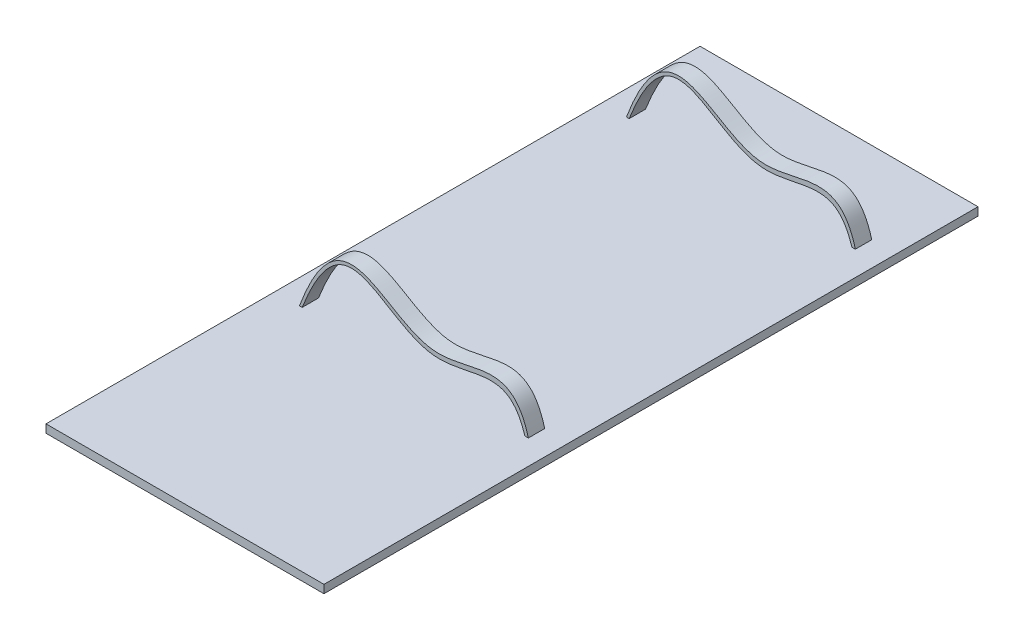
ISO-10303-21;
HEADER;
FILE_DESCRIPTION(('STEP AP214'),'2;1');
FILE_NAME('part.step','',(''),(''),'','','');
FILE_SCHEMA(('AUTOMOTIVE_DESIGN { 1 0 10303 214 1 1 1 1 }'));
ENDSEC;
DATA;
#1=APPLICATION_CONTEXT('core data for automotive mechanical design processes');
#2=APPLICATION_PROTOCOL_DEFINITION('international standard','automotive_design',2000,#1);
#3=PRODUCT_CONTEXT('',#1,'mechanical');
#4=PRODUCT('Part','Part','',(#3));
#5=PRODUCT_RELATED_PRODUCT_CATEGORY('part','',(#4));
#6=PRODUCT_DEFINITION_FORMATION('','',#4);
#7=PRODUCT_DEFINITION_CONTEXT('part definition',#1,'design');
#8=PRODUCT_DEFINITION('design','',#6,#7);
#9=PRODUCT_DEFINITION_SHAPE('','',#8);
#10=(LENGTH_UNIT() NAMED_UNIT(*) SI_UNIT(.MILLI.,.METRE.));
#11=(NAMED_UNIT(*) PLANE_ANGLE_UNIT() SI_UNIT($,.RADIAN.));
#12=(NAMED_UNIT(*) SI_UNIT($,.STERADIAN.) SOLID_ANGLE_UNIT());
#13=UNCERTAINTY_MEASURE_WITH_UNIT(LENGTH_MEASURE(1.E-05),#10,'distance_accuracy_value','');
#14=(GEOMETRIC_REPRESENTATION_CONTEXT(3) GLOBAL_UNCERTAINTY_ASSIGNED_CONTEXT((#13)) GLOBAL_UNIT_ASSIGNED_CONTEXT((#10,
#11,#12)) REPRESENTATION_CONTEXT('',''));
#15=CARTESIAN_POINT('',(0.,0.,0.));
#16=DIRECTION('',(0.,0.,1.));
#17=DIRECTION('',(1.,0.,0.));
#18=AXIS2_PLACEMENT_3D('',#15,#16,#17);
#19=CARTESIAN_POINT('',(0.,2.5,0.));
#20=DIRECTION('',(0.,-1.,0.));
#21=DIRECTION('',(0.,0.,-1.));
#22=AXIS2_PLACEMENT_3D('',#19,#20,#21);
#23=PLANE('',#22);
#24=DIRECTION('',(-1.,0.,0.));
#25=VECTOR('',#24,1.);
#26=CARTESIAN_POINT('',(77.5,2.5,-70.));
#27=LINE('',#26,#25);
#28=CARTESIAN_POINT('',(77.5,2.5,-70.));
#29=VERTEX_POINT('',#28);
#30=CARTESIAN_POINT('',(76.450132058504,2.5,-70.));
#31=VERTEX_POINT('',#30);
#32=EDGE_CURVE('E122',#29,#31,#27,.T.);
#33=ORIENTED_EDGE('',*,*,#32,.T.);
#34=DIRECTION('',(0.,0.,-1.));
#35=VECTOR('',#34,1.);
#36=CARTESIAN_POINT('',(76.450132058504,2.5,-70.));
#37=LINE('',#36,#35);
#38=CARTESIAN_POINT('',(76.450132058504,2.5,-75.));
#39=VERTEX_POINT('',#38);
#40=EDGE_CURVE('E143',#31,#39,#37,.T.);
#41=ORIENTED_EDGE('',*,*,#40,.T.);
#42=DIRECTION('',(-1.,0.,0.));
#43=VECTOR('',#42,1.);
#44=CARTESIAN_POINT('',(77.5,2.5,-75.));
#45=LINE('',#44,#43);
#46=CARTESIAN_POINT('',(77.5,2.5,-75.));
#47=VERTEX_POINT('',#46);
#48=EDGE_CURVE('E142',#47,#39,#45,.T.);
#49=ORIENTED_EDGE('',*,*,#48,.F.);
#50=DIRECTION('',(0.,0.,-1.));
#51=VECTOR('',#50,1.);
#52=CARTESIAN_POINT('',(77.5,2.5,-70.));
#53=LINE('',#52,#51);
#54=EDGE_CURVE('E135',#29,#47,#53,.T.);
#55=ORIENTED_EDGE('',*,*,#54,.F.);
#56=EDGE_LOOP('',(#33,#41,#49,#55));
#57=FACE_BOUND('',#56,.T.);
#58=DIRECTION('',(-1.,0.,0.));
#59=VECTOR('',#58,1.);
#60=CARTESIAN_POINT('',(77.5,2.5,-170.));
#61=LINE('',#60,#59);
#62=CARTESIAN_POINT('',(77.5,2.5,-170.));
#63=VERTEX_POINT('',#62);
#64=CARTESIAN_POINT('',(76.450132058504,2.5,-170.));
#65=VERTEX_POINT('',#64);
#66=EDGE_CURVE('E157',#63,#65,#61,.T.);
#67=ORIENTED_EDGE('',*,*,#66,.T.);
#68=DIRECTION('',(0.,0.,-1.));
#69=VECTOR('',#68,1.);
#70=CARTESIAN_POINT('',(76.450132058504,2.5,-170.));
#71=LINE('',#70,#69);
#72=CARTESIAN_POINT('',(76.450132058504,2.5,-175.));
#73=VERTEX_POINT('',#72);
#74=EDGE_CURVE('E234',#65,#73,#71,.T.);
#75=ORIENTED_EDGE('',*,*,#74,.T.);
#76=DIRECTION('',(-1.,0.,0.));
#77=VECTOR('',#76,1.);
#78=CARTESIAN_POINT('',(77.5,2.5,-175.));
#79=LINE('',#78,#77);
#80=CARTESIAN_POINT('',(77.5,2.5,-175.));
#81=VERTEX_POINT('',#80);
#82=EDGE_CURVE('E300',#81,#73,#79,.T.);
#83=ORIENTED_EDGE('',*,*,#82,.F.);
#84=DIRECTION('',(0.,0.,-1.));
#85=VECTOR('',#84,1.);
#86=CARTESIAN_POINT('',(77.5,2.5,-170.));
#87=LINE('',#86,#85);
#88=EDGE_CURVE('E241',#63,#81,#87,.T.);
#89=ORIENTED_EDGE('',*,*,#88,.F.);
#90=EDGE_LOOP('',(#67,#75,#83,#89));
#91=FACE_BOUND('',#90,.T.);
#92=DIRECTION('',(0.,0.,1.));
#93=VECTOR('',#92,1.);
#94=CARTESIAN_POINT('',(0.,2.5,0.));
#95=LINE('',#94,#93);
#96=CARTESIAN_POINT('',(0.,2.5,-200.));
#97=VERTEX_POINT('',#96);
#98=CARTESIAN_POINT('',(0.,2.5,0.));
#99=VERTEX_POINT('',#98);
#100=EDGE_CURVE('E209',#97,#99,#95,.T.);
#101=ORIENTED_EDGE('',*,*,#100,.T.);
#102=DIRECTION('',(1.,0.,0.));
#103=VECTOR('',#102,1.);
#104=CARTESIAN_POINT('',(0.,2.5,0.));
#105=LINE('',#104,#103);
#106=CARTESIAN_POINT('',(85.,2.5,0.));
#107=VERTEX_POINT('',#106);
#108=EDGE_CURVE('E223',#99,#107,#105,.T.);
#109=ORIENTED_EDGE('',*,*,#108,.T.);
#110=DIRECTION('',(0.,0.,-1.));
#111=VECTOR('',#110,1.);
#112=CARTESIAN_POINT('',(85.,2.5,0.));
#113=LINE('',#112,#111);
#114=CARTESIAN_POINT('',(85.,2.5,-200.));
#115=VERTEX_POINT('',#114);
#116=EDGE_CURVE('E204',#107,#115,#113,.T.);
#117=ORIENTED_EDGE('',*,*,#116,.T.);
#118=DIRECTION('',(-1.,0.,0.));
#119=VECTOR('',#118,1.);
#120=CARTESIAN_POINT('',(0.,2.5,-200.));
#121=LINE('',#120,#119);
#122=EDGE_CURVE('E216',#115,#97,#121,.T.);
#123=ORIENTED_EDGE('',*,*,#122,.T.);
#124=EDGE_LOOP('',(#101,#109,#117,#123));
#125=FACE_BOUND('',#124,.T.);
#126=DIRECTION('',(-1.,0.,0.));
#127=VECTOR('',#126,1.);
#128=CARTESIAN_POINT('',(8.33670505188138,2.5,-170.));
#129=LINE('',#128,#127);
#130=CARTESIAN_POINT('',(8.33670505188136,2.5,-170.));
#131=VERTEX_POINT('',#130);
#132=CARTESIAN_POINT('',(7.50000000000001,2.50000000000001,-170.));
#133=VERTEX_POINT('',#132);
#134=EDGE_CURVE('E244',#131,#133,#129,.T.);
#135=ORIENTED_EDGE('',*,*,#134,.T.);
#136=DIRECTION('',(0.,0.,-1.));
#137=VECTOR('',#136,1.);
#138=CARTESIAN_POINT('',(7.50000000000001,2.50000000000001,-170.));
#139=LINE('',#138,#137);
#140=CARTESIAN_POINT('',(7.50000000000001,2.50000000000001,-175.));
#141=VERTEX_POINT('',#140);
#142=EDGE_CURVE('E226',#133,#141,#139,.T.);
#143=ORIENTED_EDGE('',*,*,#142,.T.);
#144=DIRECTION('',(-1.,0.,0.));
#145=VECTOR('',#144,1.);
#146=CARTESIAN_POINT('',(8.33670505188138,2.5,-175.));
#147=LINE('',#146,#145);
#148=CARTESIAN_POINT('',(8.33670505188136,2.5,-175.));
#149=VERTEX_POINT('',#148);
#150=EDGE_CURVE('E158',#149,#141,#147,.T.);
#151=ORIENTED_EDGE('',*,*,#150,.F.);
#152=DIRECTION('',(0.,0.,-1.));
#153=VECTOR('',#152,1.);
#154=CARTESIAN_POINT('',(8.33670505188136,2.5,-170.));
#155=LINE('',#154,#153);
#156=EDGE_CURVE('E228',#131,#149,#155,.T.);
#157=ORIENTED_EDGE('',*,*,#156,.F.);
#158=EDGE_LOOP('',(#135,#143,#151,#157));
#159=FACE_BOUND('',#158,.T.);
#160=DIRECTION('',(-1.,0.,0.));
#161=VECTOR('',#160,1.);
#162=CARTESIAN_POINT('',(8.33670505188138,2.5,-70.));
#163=LINE('',#162,#161);
#164=CARTESIAN_POINT('',(8.33670505188136,2.5,-70.));
#165=VERTEX_POINT('',#164);
#166=CARTESIAN_POINT('',(7.50000000000001,2.50000000000001,-70.));
#167=VERTEX_POINT('',#166);
#168=EDGE_CURVE('E144',#165,#167,#163,.T.);
#169=ORIENTED_EDGE('',*,*,#168,.T.);
#170=DIRECTION('',(0.,0.,-1.));
#171=VECTOR('',#170,1.);
#172=CARTESIAN_POINT('',(7.50000000000001,2.50000000000001,-70.));
#173=LINE('',#172,#171);
#174=CARTESIAN_POINT('',(7.50000000000001,2.50000000000001,-75.));
#175=VERTEX_POINT('',#174);
#176=EDGE_CURVE('E138',#167,#175,#173,.T.);
#177=ORIENTED_EDGE('',*,*,#176,.T.);
#178=DIRECTION('',(-1.,0.,0.));
#179=VECTOR('',#178,1.);
#180=CARTESIAN_POINT('',(8.33670505188138,2.5,-75.));
#181=LINE('',#180,#179);
#182=CARTESIAN_POINT('',(8.33670505188136,2.5,-75.));
#183=VERTEX_POINT('',#182);
#184=EDGE_CURVE('E139',#183,#175,#181,.T.);
#185=ORIENTED_EDGE('',*,*,#184,.F.);
#186=DIRECTION('',(0.,0.,-1.));
#187=VECTOR('',#186,1.);
#188=CARTESIAN_POINT('',(8.33670505188136,2.5,-70.));
#189=LINE('',#188,#187);
#190=EDGE_CURVE('E146',#165,#183,#189,.T.);
#191=ORIENTED_EDGE('',*,*,#190,.F.);
#192=EDGE_LOOP('',(#169,#177,#185,#191));
#193=FACE_BOUND('',#192,.T.);
#194=ADVANCED_FACE('F33',(#57,#91,#125,#159,#193),#23,.F.);
#195=CARTESIAN_POINT('',(0.,2.5,0.));
#196=DIRECTION('',(1.,0.,0.));
#197=DIRECTION('',(0.,0.,-1.));
#198=AXIS2_PLACEMENT_3D('',#195,#196,#197);
#199=PLANE('',#198);
#200=DIRECTION('',(0.,0.,1.));
#201=VECTOR('',#200,1.);
#202=CARTESIAN_POINT('',(0.,0.,0.));
#203=LINE('',#202,#201);
#204=CARTESIAN_POINT('',(0.,0.,-200.));
#205=VERTEX_POINT('',#204);
#206=CARTESIAN_POINT('',(0.,0.,0.));
#207=VERTEX_POINT('',#206);
#208=EDGE_CURVE('E200',#205,#207,#203,.T.);
#209=ORIENTED_EDGE('',*,*,#208,.T.);
#210=DIRECTION('',(0.,-1.,0.));
#211=VECTOR('',#210,1.);
#212=CARTESIAN_POINT('',(0.,2.5,0.));
#213=LINE('',#212,#211);
#214=EDGE_CURVE('E11',#99,#207,#213,.T.);
#215=ORIENTED_EDGE('',*,*,#214,.F.);
#216=ORIENTED_EDGE('',*,*,#100,.F.);
#217=DIRECTION('',(0.,-1.,0.));
#218=VECTOR('',#217,1.);
#219=CARTESIAN_POINT('',(0.,2.5,-200.));
#220=LINE('',#219,#218);
#221=EDGE_CURVE('E213',#97,#205,#220,.T.);
#222=ORIENTED_EDGE('',*,*,#221,.T.);
#223=EDGE_LOOP('',(#209,#215,#216,#222));
#224=FACE_BOUND('',#223,.T.);
#225=ADVANCED_FACE('F35',(#224),#199,.F.);
#226=CARTESIAN_POINT('',(0.,2.5,0.));
#227=DIRECTION('',(0.,0.,-1.));
#228=DIRECTION('',(-1.,0.,0.));
#229=AXIS2_PLACEMENT_3D('',#226,#227,#228);
#230=PLANE('',#229);
#231=DIRECTION('',(1.,0.,0.));
#232=VECTOR('',#231,1.);
#233=CARTESIAN_POINT('',(0.,0.,0.));
#234=LINE('',#233,#232);
#235=CARTESIAN_POINT('',(85.,0.,0.));
#236=VERTEX_POINT('',#235);
#237=EDGE_CURVE('E192',#207,#236,#234,.T.);
#238=ORIENTED_EDGE('',*,*,#237,.T.);
#239=DIRECTION('',(0.,-1.,0.));
#240=VECTOR('',#239,1.);
#241=CARTESIAN_POINT('',(85.,2.5,0.));
#242=LINE('',#241,#240);
#243=EDGE_CURVE('E41',#107,#236,#242,.T.);
#244=ORIENTED_EDGE('',*,*,#243,.F.);
#245=ORIENTED_EDGE('',*,*,#108,.F.);
#246=ORIENTED_EDGE('',*,*,#214,.T.);
#247=EDGE_LOOP('',(#238,#244,#245,#246));
#248=FACE_BOUND('',#247,.T.);
#249=ADVANCED_FACE('F183',(#248),#230,.F.);
#250=CARTESIAN_POINT('',(85.,2.5,0.));
#251=DIRECTION('',(-1.,0.,0.));
#252=DIRECTION('',(0.,0.,1.));
#253=AXIS2_PLACEMENT_3D('',#250,#251,#252);
#254=PLANE('',#253);
#255=DIRECTION('',(0.,0.,-1.));
#256=VECTOR('',#255,1.);
#257=CARTESIAN_POINT('',(85.,0.,0.));
#258=LINE('',#257,#256);
#259=CARTESIAN_POINT('',(85.,0.,-200.));
#260=VERTEX_POINT('',#259);
#261=EDGE_CURVE('E199',#236,#260,#258,.T.);
#262=ORIENTED_EDGE('',*,*,#261,.T.);
#263=DIRECTION('',(0.,-1.,0.));
#264=VECTOR('',#263,1.);
#265=CARTESIAN_POINT('',(85.,2.5,-200.));
#266=LINE('',#265,#264);
#267=EDGE_CURVE('E205',#115,#260,#266,.T.);
#268=ORIENTED_EDGE('',*,*,#267,.F.);
#269=ORIENTED_EDGE('',*,*,#116,.F.);
#270=ORIENTED_EDGE('',*,*,#243,.T.);
#271=EDGE_LOOP('',(#262,#268,#269,#270));
#272=FACE_BOUND('',#271,.T.);
#273=ADVANCED_FACE('F180',(#272),#254,.F.);
#274=CARTESIAN_POINT('',(0.,2.5,-200.));
#275=DIRECTION('',(0.,0.,1.));
#276=DIRECTION('',(1.,0.,0.));
#277=AXIS2_PLACEMENT_3D('',#274,#275,#276);
#278=PLANE('',#277);
#279=DIRECTION('',(-1.,0.,0.));
#280=VECTOR('',#279,1.);
#281=CARTESIAN_POINT('',(0.,0.,-200.));
#282=LINE('',#281,#280);
#283=EDGE_CURVE('E207',#260,#205,#282,.T.);
#284=ORIENTED_EDGE('',*,*,#283,.T.);
#285=ORIENTED_EDGE('',*,*,#221,.F.);
#286=ORIENTED_EDGE('',*,*,#122,.F.);
#287=ORIENTED_EDGE('',*,*,#267,.T.);
#288=EDGE_LOOP('',(#284,#285,#286,#287));
#289=FACE_BOUND('',#288,.T.);
#290=ADVANCED_FACE('F176',(#289),#278,.F.);
#291=CARTESIAN_POINT('',(0.,0.,0.));
#292=DIRECTION('',(0.,-1.,0.));
#293=DIRECTION('',(0.,0.,-1.));
#294=AXIS2_PLACEMENT_3D('',#291,#292,#293);
#295=PLANE('',#294);
#296=ORIENTED_EDGE('',*,*,#208,.F.);
#297=ORIENTED_EDGE('',*,*,#283,.F.);
#298=ORIENTED_EDGE('',*,*,#261,.F.);
#299=ORIENTED_EDGE('',*,*,#237,.F.);
#300=EDGE_LOOP('',(#296,#297,#298,#299));
#301=FACE_BOUND('',#300,.T.);
#302=ADVANCED_FACE('F169',(#301),#295,.T.);
#303=CARTESIAN_POINT('',(7.50000000000003,2.49999999999996,-170.));
#304=CARTESIAN_POINT('',(20.7503773694549,38.1550469393543,-170.));
#305=CARTESIAN_POINT('',(41.3863393114841,-5.26328621300073,-170.));
#306=CARTESIAN_POINT('',(72.4584181924559,21.0919361552375,-170.));
#307=CARTESIAN_POINT('',(77.5,2.5,-170.));
#308=B_SPLINE_CURVE_WITH_KNOTS('',3,(#303,#304,#305,#306,#307),.UNSPECIFIED.,.F.,.F.,(4,1,4),
(0.,0.588591501441247,1.),.UNSPECIFIED.);
#309=DIRECTION('',(0.,0.,-1.));
#310=VECTOR('',#309,1.);
#311=SURFACE_OF_LINEAR_EXTRUSION('',#308,#310);
#312=CARTESIAN_POINT('',(7.50000000000003,2.49999999999996,-175.));
#313=CARTESIAN_POINT('',(20.7503773694549,38.1550469393543,-175.));
#314=CARTESIAN_POINT('',(41.3863393114841,-5.26328621300073,-175.));
#315=CARTESIAN_POINT('',(72.4584181924559,21.0919361552375,-175.));
#316=CARTESIAN_POINT('',(77.5,2.5,-175.));
#317=B_SPLINE_CURVE_WITH_KNOTS('',3,(#312,#313,#314,#315,#316),.UNSPECIFIED.,.F.,.F.,(4,1,4),
(0.,0.588591501441247,1.),.UNSPECIFIED.);
#318=EDGE_CURVE('E251',#141,#81,#317,.T.);
#319=ORIENTED_EDGE('',*,*,#318,.F.);
#320=ORIENTED_EDGE('',*,*,#142,.F.);
#321=EDGE_CURVE('E151',#133,#63,#308,.T.);
#322=ORIENTED_EDGE('',*,*,#321,.T.);
#323=ORIENTED_EDGE('',*,*,#88,.T.);
#324=EDGE_LOOP('',(#319,#320,#322,#323));
#325=FACE_BOUND('',#324,.T.);
#326=ADVANCED_FACE('F164',(#325),#311,.T.);
#327=CARTESIAN_POINT('',(76.450132058504,2.5,-170.));
#328=CARTESIAN_POINT('',(76.3520370229202,2.81315595184835,-170.));
#329=CARTESIAN_POINT('',(76.1416537812512,3.44877497866969,-170.));
#330=CARTESIAN_POINT('',(75.7129202380825,4.60640844995392,-170.));
#331=CARTESIAN_POINT('',(75.1417116975274,5.91494929686498,-170.));
#332=CARTESIAN_POINT('',(74.4126275956874,7.25524748731174,-170.));
#333=CARTESIAN_POINT('',(73.3875356739377,8.76397546363312,-170.));
#334=CARTESIAN_POINT('',(72.0225484703189,10.1662017053636,-170.));
#335=CARTESIAN_POINT('',(70.2636734209677,11.2326069332151,-170.));
#336=CARTESIAN_POINT('',(68.3484277289327,11.8199018520015,-170.));
#337=CARTESIAN_POINT('',(65.5523952489699,12.079641821826,-170.));
#338=CARTESIAN_POINT('',(61.6407791202678,11.600566428748,-170.));
#339=CARTESIAN_POINT('',(56.5471043429805,10.4790987087481,-170.));
#340=CARTESIAN_POINT('',(52.1540530671029,9.79416892377267,-170.));
#341=CARTESIAN_POINT('',(48.6100688198017,9.85355521915895,-170.));
#342=CARTESIAN_POINT('',(45.1382394846425,10.4850135597298,-170.));
#343=CARTESIAN_POINT('',(41.0551540925906,12.1137122300493,-170.));
#344=CARTESIAN_POINT('',(36.4555744429649,14.7462312765996,-170.));
#345=CARTESIAN_POINT('',(32.098424566214,17.4434965844079,-170.));
#346=CARTESIAN_POINT('',(27.9550004531632,19.6059658583664,-170.));
#347=CARTESIAN_POINT('',(24.0674087982846,20.6515255794248,-170.));
#348=CARTESIAN_POINT('',(21.0365199021474,20.2607059702336,-170.));
#349=CARTESIAN_POINT('',(18.540531076815,18.923836600625,-170.));
#350=CARTESIAN_POINT('',(16.6036953519787,17.2893079386612,-170.));
#351=CARTESIAN_POINT('',(14.6063684818953,14.9259839673382,-170.));
#352=CARTESIAN_POINT('',(12.9006836085462,12.2800761385788,-170.));
#353=CARTESIAN_POINT('',(11.5149737149703,9.71999138904368,-170.));
#354=CARTESIAN_POINT('',(10.4661693558208,7.57085139889604,-170.));
#355=CARTESIAN_POINT('',(9.58244987043163,5.57633306131142,-170.));
#356=CARTESIAN_POINT('',(8.87426380070527,3.86593661286092,-170.));
#357=CARTESIAN_POINT('',(8.51197200372512,2.95165797643181,-170.));
#358=CARTESIAN_POINT('',(8.33670505188136,2.5,-170.));
#359=B_SPLINE_CURVE_WITH_KNOTS('',3,(#327,#328,#329,#330,#331,#332,#333,#334,#335,#336,#337,
#338,#339,#340,#341,#342,#343,#344,#345,#346,#347,#348,#349,#350,#351,#352,#353,#354,#355,#356,
#357,#358),.UNSPECIFIED.,.F.,.F.,(4,1,1,1,1,1,1,1,1,1,1,1,1,1,1,1,1,1,1,1,1,1,1,1,1,1,1,1,1,4),
(0.,0.0078125,0.015625,0.03125,0.046875,0.0625,0.09375,0.125,0.15625,0.1875,0.25,0.3125,0.375,
0.40625,0.4375,0.5,0.5625,0.625,0.6875,0.75,0.8125,0.84375,0.875,0.90625,0.9375,0.953125,
0.96875,0.984375,0.9921875,1.),.UNSPECIFIED.);
#360=DIRECTION('',(0.,0.,-1.));
#361=VECTOR('',#360,1.);
#362=SURFACE_OF_LINEAR_EXTRUSION('',#359,#361);
#363=CARTESIAN_POINT('',(76.450132058504,2.5,-175.));
#364=CARTESIAN_POINT('',(76.3520370229202,2.81315595184835,-175.));
#365=CARTESIAN_POINT('',(76.1416537812512,3.44877497866969,-175.));
#366=CARTESIAN_POINT('',(75.7129202380825,4.60640844995392,-175.));
#367=CARTESIAN_POINT('',(75.1417116975274,5.91494929686498,-175.));
#368=CARTESIAN_POINT('',(74.4126275956874,7.25524748731174,-175.));
#369=CARTESIAN_POINT('',(73.3875356739377,8.76397546363312,-175.));
#370=CARTESIAN_POINT('',(72.0225484703189,10.1662017053636,-175.));
#371=CARTESIAN_POINT('',(70.2636734209677,11.2326069332151,-175.));
#372=CARTESIAN_POINT('',(68.3484277289327,11.8199018520015,-175.));
#373=CARTESIAN_POINT('',(65.5523952489699,12.079641821826,-175.));
#374=CARTESIAN_POINT('',(61.6407791202678,11.600566428748,-175.));
#375=CARTESIAN_POINT('',(56.5471043429805,10.4790987087481,-175.));
#376=CARTESIAN_POINT('',(52.1540530671029,9.79416892377267,-175.));
#377=CARTESIAN_POINT('',(48.6100688198017,9.85355521915895,-175.));
#378=CARTESIAN_POINT('',(45.1382394846425,10.4850135597298,-175.));
#379=CARTESIAN_POINT('',(41.0551540925906,12.1137122300493,-175.));
#380=CARTESIAN_POINT('',(36.4555744429649,14.7462312765996,-175.));
#381=CARTESIAN_POINT('',(32.098424566214,17.4434965844079,-175.));
#382=CARTESIAN_POINT('',(27.9550004531632,19.6059658583664,-175.));
#383=CARTESIAN_POINT('',(24.0674087982846,20.6515255794248,-175.));
#384=CARTESIAN_POINT('',(21.0365199021474,20.2607059702336,-175.));
#385=CARTESIAN_POINT('',(18.540531076815,18.923836600625,-175.));
#386=CARTESIAN_POINT('',(16.6036953519787,17.2893079386612,-175.));
#387=CARTESIAN_POINT('',(14.6063684818953,14.9259839673382,-175.));
#388=CARTESIAN_POINT('',(12.9006836085462,12.2800761385788,-175.));
#389=CARTESIAN_POINT('',(11.5149737149703,9.71999138904368,-175.));
#390=CARTESIAN_POINT('',(10.4661693558208,7.57085139889604,-175.));
#391=CARTESIAN_POINT('',(9.58244987043163,5.57633306131142,-175.));
#392=CARTESIAN_POINT('',(8.87426380070527,3.86593661286092,-175.));
#393=CARTESIAN_POINT('',(8.51197200372512,2.95165797643181,-175.));
#394=CARTESIAN_POINT('',(8.33670505188136,2.5,-175.));
#395=B_SPLINE_CURVE_WITH_KNOTS('',3,(#363,#364,#365,#366,#367,#368,#369,#370,#371,#372,#373,
#374,#375,#376,#377,#378,#379,#380,#381,#382,#383,#384,#385,#386,#387,#388,#389,#390,#391,#392,
#393,#394),.UNSPECIFIED.,.F.,.F.,(4,1,1,1,1,1,1,1,1,1,1,1,1,1,1,1,1,1,1,1,1,1,1,1,1,1,1,1,1,4),
(0.,0.0078125,0.015625,0.03125,0.046875,0.0625,0.09375,0.125,0.15625,0.1875,0.25,0.3125,0.375,
0.40625,0.4375,0.5,0.5625,0.625,0.6875,0.75,0.8125,0.84375,0.875,0.90625,0.9375,0.953125,
0.96875,0.984375,0.9921875,1.),.UNSPECIFIED.);
#396=EDGE_CURVE('E305',#73,#149,#395,.T.);
#397=ORIENTED_EDGE('',*,*,#396,.F.);
#398=ORIENTED_EDGE('',*,*,#74,.F.);
#399=EDGE_CURVE('E318',#65,#131,#359,.T.);
#400=ORIENTED_EDGE('',*,*,#399,.T.);
#401=ORIENTED_EDGE('',*,*,#156,.T.);
#402=EDGE_LOOP('',(#397,#398,#400,#401));
#403=FACE_BOUND('',#402,.T.);
#404=ADVANCED_FACE('F168',(#403),#362,.T.);
#405=CARTESIAN_POINT('',(41.7707359687785,13.1923978078801,-170.));
#406=DIRECTION('',(0.,0.,-1.));
#407=DIRECTION('',(-1.,0.,0.));
#408=AXIS2_PLACEMENT_3D('',#405,#406,#407);
#409=PLANE('',#408);
#410=ORIENTED_EDGE('',*,*,#321,.F.);
#411=ORIENTED_EDGE('',*,*,#134,.F.);
#412=ORIENTED_EDGE('',*,*,#399,.F.);
#413=ORIENTED_EDGE('',*,*,#66,.F.);
#414=EDGE_LOOP('',(#410,#411,#412,#413));
#415=FACE_BOUND('',#414,.T.);
#416=ADVANCED_FACE('F284',(#415),#409,.F.);
#417=CARTESIAN_POINT('',(41.7707359687785,13.1923978078801,-175.));
#418=DIRECTION('',(0.,0.,-1.));
#419=DIRECTION('',(-1.,0.,0.));
#420=AXIS2_PLACEMENT_3D('',#417,#418,#419);
#421=PLANE('',#420);
#422=ORIENTED_EDGE('',*,*,#318,.T.);
#423=ORIENTED_EDGE('',*,*,#82,.T.);
#424=ORIENTED_EDGE('',*,*,#396,.T.);
#425=ORIENTED_EDGE('',*,*,#150,.T.);
#426=EDGE_LOOP('',(#422,#423,#424,#425));
#427=FACE_BOUND('',#426,.T.);
#428=ADVANCED_FACE('F283',(#427),#421,.T.);
#429=CARTESIAN_POINT('',(7.50000000000003,2.49999999999996,-70.));
#430=CARTESIAN_POINT('',(20.7503773694549,38.1550469393543,-70.));
#431=CARTESIAN_POINT('',(41.3863393114841,-5.26328621300073,-70.));
#432=CARTESIAN_POINT('',(72.4584181924559,21.0919361552375,-70.));
#433=CARTESIAN_POINT('',(77.5,2.5,-70.));
#434=B_SPLINE_CURVE_WITH_KNOTS('',3,(#429,#430,#431,#432,#433),.UNSPECIFIED.,.F.,.F.,(4,1,4),
(0.,0.588591501441247,1.),.UNSPECIFIED.);
#435=DIRECTION('',(0.,0.,-1.));
#436=VECTOR('',#435,1.);
#437=SURFACE_OF_LINEAR_EXTRUSION('',#434,#436);
#438=CARTESIAN_POINT('',(7.50000000000003,2.49999999999996,-75.));
#439=CARTESIAN_POINT('',(20.7503773694549,38.1550469393543,-75.));
#440=CARTESIAN_POINT('',(41.3863393114841,-5.26328621300073,-75.));
#441=CARTESIAN_POINT('',(72.4584181924559,21.0919361552375,-75.));
#442=CARTESIAN_POINT('',(77.5,2.5,-75.));
#443=B_SPLINE_CURVE_WITH_KNOTS('',3,(#438,#439,#440,#441,#442),.UNSPECIFIED.,.F.,.F.,(4,1,4),
(0.,0.588591501441247,1.),.UNSPECIFIED.);
#444=EDGE_CURVE('E53',#175,#47,#443,.T.);
#445=ORIENTED_EDGE('',*,*,#444,.F.);
#446=ORIENTED_EDGE('',*,*,#176,.F.);
#447=EDGE_CURVE('E126',#167,#29,#434,.T.);
#448=ORIENTED_EDGE('',*,*,#447,.T.);
#449=ORIENTED_EDGE('',*,*,#54,.T.);
#450=EDGE_LOOP('',(#445,#446,#448,#449));
#451=FACE_BOUND('',#450,.T.);
#452=ADVANCED_FACE('F134',(#451),#437,.T.);
#453=CARTESIAN_POINT('',(76.450132058504,2.5,-70.));
#454=CARTESIAN_POINT('',(76.3520370229202,2.81315595184835,-70.));
#455=CARTESIAN_POINT('',(76.1416537812512,3.44877497866969,-70.));
#456=CARTESIAN_POINT('',(75.7129202380825,4.60640844995392,-70.));
#457=CARTESIAN_POINT('',(75.1417116975274,5.91494929686498,-70.));
#458=CARTESIAN_POINT('',(74.4126275956874,7.25524748731174,-70.));
#459=CARTESIAN_POINT('',(73.3875356739377,8.76397546363312,-70.));
#460=CARTESIAN_POINT('',(72.0225484703189,10.1662017053636,-70.));
#461=CARTESIAN_POINT('',(70.2636734209677,11.2326069332151,-70.));
#462=CARTESIAN_POINT('',(68.3484277289327,11.8199018520015,-70.));
#463=CARTESIAN_POINT('',(65.5523952489699,12.079641821826,-70.));
#464=CARTESIAN_POINT('',(61.6407791202678,11.600566428748,-70.));
#465=CARTESIAN_POINT('',(56.5471043429805,10.4790987087481,-70.));
#466=CARTESIAN_POINT('',(52.1540530671029,9.79416892377267,-70.));
#467=CARTESIAN_POINT('',(48.6100688198017,9.85355521915895,-70.));
#468=CARTESIAN_POINT('',(45.1382394846425,10.4850135597298,-70.));
#469=CARTESIAN_POINT('',(41.0551540925906,12.1137122300493,-70.));
#470=CARTESIAN_POINT('',(36.4555744429649,14.7462312765996,-70.));
#471=CARTESIAN_POINT('',(32.098424566214,17.4434965844079,-70.));
#472=CARTESIAN_POINT('',(27.9550004531632,19.6059658583664,-70.));
#473=CARTESIAN_POINT('',(24.0674087982846,20.6515255794248,-70.));
#474=CARTESIAN_POINT('',(21.0365199021474,20.2607059702336,-70.));
#475=CARTESIAN_POINT('',(18.540531076815,18.923836600625,-70.));
#476=CARTESIAN_POINT('',(16.6036953519787,17.2893079386612,-70.));
#477=CARTESIAN_POINT('',(14.6063684818953,14.9259839673382,-70.));
#478=CARTESIAN_POINT('',(12.9006836085462,12.2800761385788,-70.));
#479=CARTESIAN_POINT('',(11.5149737149703,9.71999138904368,-70.));
#480=CARTESIAN_POINT('',(10.4661693558208,7.57085139889604,-70.));
#481=CARTESIAN_POINT('',(9.58244987043163,5.57633306131142,-70.));
#482=CARTESIAN_POINT('',(8.87426380070527,3.86593661286092,-70.));
#483=CARTESIAN_POINT('',(8.51197200372512,2.95165797643181,-70.));
#484=CARTESIAN_POINT('',(8.33670505188136,2.5,-70.));
#485=B_SPLINE_CURVE_WITH_KNOTS('',3,(#453,#454,#455,#456,#457,#458,#459,#460,#461,#462,#463,
#464,#465,#466,#467,#468,#469,#470,#471,#472,#473,#474,#475,#476,#477,#478,#479,#480,#481,#482,
#483,#484),.UNSPECIFIED.,.F.,.F.,(4,1,1,1,1,1,1,1,1,1,1,1,1,1,1,1,1,1,1,1,1,1,1,1,1,1,1,1,1,4),
(0.,0.0078125,0.015625,0.03125,0.046875,0.0625,0.09375,0.125,0.15625,0.1875,0.25,0.3125,0.375,
0.40625,0.4375,0.5,0.5625,0.625,0.6875,0.75,0.8125,0.84375,0.875,0.90625,0.9375,0.953125,
0.96875,0.984375,0.9921875,1.),.UNSPECIFIED.);
#486=DIRECTION('',(0.,0.,-1.));
#487=VECTOR('',#486,1.);
#488=SURFACE_OF_LINEAR_EXTRUSION('',#485,#487);
#489=CARTESIAN_POINT('',(76.450132058504,2.5,-75.));
#490=CARTESIAN_POINT('',(76.3520370229202,2.81315595184835,-75.));
#491=CARTESIAN_POINT('',(76.1416537812512,3.44877497866969,-75.));
#492=CARTESIAN_POINT('',(75.7129202380825,4.60640844995392,-75.));
#493=CARTESIAN_POINT('',(75.1417116975274,5.91494929686498,-75.));
#494=CARTESIAN_POINT('',(74.4126275956874,7.25524748731174,-75.));
#495=CARTESIAN_POINT('',(73.3875356739377,8.76397546363312,-75.));
#496=CARTESIAN_POINT('',(72.0225484703189,10.1662017053636,-75.));
#497=CARTESIAN_POINT('',(70.2636734209677,11.2326069332151,-75.));
#498=CARTESIAN_POINT('',(68.3484277289327,11.8199018520015,-75.));
#499=CARTESIAN_POINT('',(65.5523952489699,12.079641821826,-75.));
#500=CARTESIAN_POINT('',(61.6407791202678,11.600566428748,-75.));
#501=CARTESIAN_POINT('',(56.5471043429805,10.4790987087481,-75.));
#502=CARTESIAN_POINT('',(52.1540530671029,9.79416892377267,-75.));
#503=CARTESIAN_POINT('',(48.6100688198017,9.85355521915895,-75.));
#504=CARTESIAN_POINT('',(45.1382394846425,10.4850135597298,-75.));
#505=CARTESIAN_POINT('',(41.0551540925906,12.1137122300493,-75.));
#506=CARTESIAN_POINT('',(36.4555744429649,14.7462312765996,-75.));
#507=CARTESIAN_POINT('',(32.098424566214,17.4434965844079,-75.));
#508=CARTESIAN_POINT('',(27.9550004531632,19.6059658583664,-75.));
#509=CARTESIAN_POINT('',(24.0674087982846,20.6515255794248,-75.));
#510=CARTESIAN_POINT('',(21.0365199021474,20.2607059702336,-75.));
#511=CARTESIAN_POINT('',(18.540531076815,18.923836600625,-75.));
#512=CARTESIAN_POINT('',(16.6036953519787,17.2893079386612,-75.));
#513=CARTESIAN_POINT('',(14.6063684818953,14.9259839673382,-75.));
#514=CARTESIAN_POINT('',(12.9006836085462,12.2800761385788,-75.));
#515=CARTESIAN_POINT('',(11.5149737149703,9.71999138904368,-75.));
#516=CARTESIAN_POINT('',(10.4661693558208,7.57085139889604,-75.));
#517=CARTESIAN_POINT('',(9.58244987043163,5.57633306131142,-75.));
#518=CARTESIAN_POINT('',(8.87426380070527,3.86593661286092,-75.));
#519=CARTESIAN_POINT('',(8.51197200372512,2.95165797643181,-75.));
#520=CARTESIAN_POINT('',(8.33670505188136,2.5,-75.));
#521=B_SPLINE_CURVE_WITH_KNOTS('',3,(#489,#490,#491,#492,#493,#494,#495,#496,#497,#498,#499,
#500,#501,#502,#503,#504,#505,#506,#507,#508,#509,#510,#511,#512,#513,#514,#515,#516,#517,#518,
#519,#520),.UNSPECIFIED.,.F.,.F.,(4,1,1,1,1,1,1,1,1,1,1,1,1,1,1,1,1,1,1,1,1,1,1,1,1,1,1,1,1,4),
(0.,0.0078125,0.015625,0.03125,0.046875,0.0625,0.09375,0.125,0.15625,0.1875,0.25,0.3125,0.375,
0.40625,0.4375,0.5,0.5625,0.625,0.6875,0.75,0.8125,0.84375,0.875,0.90625,0.9375,0.953125,
0.96875,0.984375,0.9921875,1.),.UNSPECIFIED.);
#522=EDGE_CURVE('E48',#39,#183,#521,.T.);
#523=ORIENTED_EDGE('',*,*,#522,.F.);
#524=ORIENTED_EDGE('',*,*,#40,.F.);
#525=EDGE_CURVE('E128',#31,#165,#485,.T.);
#526=ORIENTED_EDGE('',*,*,#525,.T.);
#527=ORIENTED_EDGE('',*,*,#190,.T.);
#528=EDGE_LOOP('',(#523,#524,#526,#527));
#529=FACE_BOUND('',#528,.T.);
#530=ADVANCED_FACE('F275',(#529),#488,.T.);
#531=CARTESIAN_POINT('',(41.7707359687785,13.1923978078801,-70.));
#532=DIRECTION('',(0.,0.,-1.));
#533=DIRECTION('',(-1.,0.,0.));
#534=AXIS2_PLACEMENT_3D('',#531,#532,#533);
#535=PLANE('',#534);
#536=ORIENTED_EDGE('',*,*,#447,.F.);
#537=ORIENTED_EDGE('',*,*,#168,.F.);
#538=ORIENTED_EDGE('',*,*,#525,.F.);
#539=ORIENTED_EDGE('',*,*,#32,.F.);
#540=EDGE_LOOP('',(#536,#537,#538,#539));
#541=FACE_BOUND('',#540,.T.);
#542=ADVANCED_FACE('F124',(#541),#535,.F.);
#543=CARTESIAN_POINT('',(41.7707359687785,13.1923978078801,-75.));
#544=DIRECTION('',(0.,0.,-1.));
#545=DIRECTION('',(-1.,0.,0.));
#546=AXIS2_PLACEMENT_3D('',#543,#544,#545);
#547=PLANE('',#546);
#548=ORIENTED_EDGE('',*,*,#444,.T.);
#549=ORIENTED_EDGE('',*,*,#48,.T.);
#550=ORIENTED_EDGE('',*,*,#522,.T.);
#551=ORIENTED_EDGE('',*,*,#184,.T.);
#552=EDGE_LOOP('',(#548,#549,#550,#551));
#553=FACE_BOUND('',#552,.T.);
#554=ADVANCED_FACE('F279',(#553),#547,.T.);
#555=CLOSED_SHELL('',(#194,#225,#249,#273,#290,#302,#326,#404,#416,#428,#452,#530,#542,#554));
#556=MANIFOLD_SOLID_BREP('B2',#555);
#557=ADVANCED_BREP_SHAPE_REPRESENTATION('',(#18,#556),#14);
#558=SHAPE_DEFINITION_REPRESENTATION(#9,#557);
ENDSEC;
END-ISO-10303-21;
